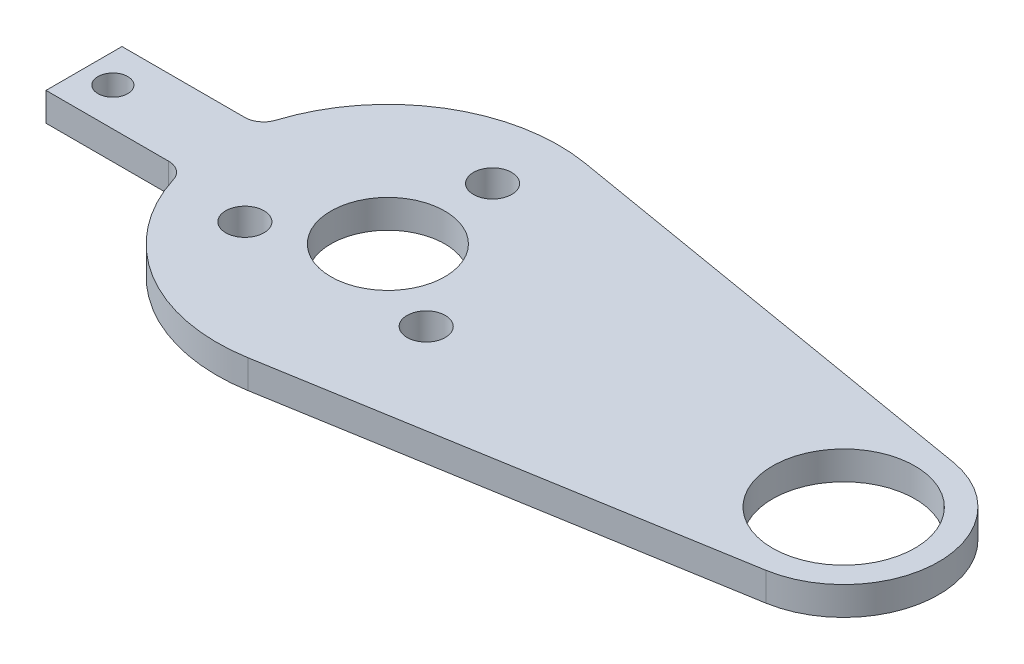
ISO-10303-21;
HEADER;
FILE_DESCRIPTION(('STEP AP214'),'2;1');
FILE_NAME('part.step','',(''),(''),'','','');
FILE_SCHEMA(('AUTOMOTIVE_DESIGN { 1 0 10303 214 1 1 1 1 }'));
ENDSEC;
DATA;
#1=APPLICATION_CONTEXT('core data for automotive mechanical design processes');
#2=APPLICATION_PROTOCOL_DEFINITION('international standard','automotive_design',2000,#1);
#3=PRODUCT_CONTEXT('',#1,'mechanical');
#4=PRODUCT('Part','Part','',(#3));
#5=PRODUCT_RELATED_PRODUCT_CATEGORY('part','',(#4));
#6=PRODUCT_DEFINITION_FORMATION('','',#4);
#7=PRODUCT_DEFINITION_CONTEXT('part definition',#1,'design');
#8=PRODUCT_DEFINITION('design','',#6,#7);
#9=PRODUCT_DEFINITION_SHAPE('','',#8);
#10=(LENGTH_UNIT() NAMED_UNIT(*) SI_UNIT(.MILLI.,.METRE.));
#11=(NAMED_UNIT(*) PLANE_ANGLE_UNIT() SI_UNIT($,.RADIAN.));
#12=(NAMED_UNIT(*) SI_UNIT($,.STERADIAN.) SOLID_ANGLE_UNIT());
#13=UNCERTAINTY_MEASURE_WITH_UNIT(LENGTH_MEASURE(1.E-05),#10,'distance_accuracy_value','');
#14=(GEOMETRIC_REPRESENTATION_CONTEXT(3) GLOBAL_UNCERTAINTY_ASSIGNED_CONTEXT((#13)) GLOBAL_UNIT_ASSIGNED_CONTEXT((#10,
#11,#12)) REPRESENTATION_CONTEXT('',''));
#15=CARTESIAN_POINT('',(0.,0.,0.));
#16=DIRECTION('',(0.,0.,1.));
#17=DIRECTION('',(1.,0.,0.));
#18=AXIS2_PLACEMENT_3D('',#15,#16,#17);
#19=CARTESIAN_POINT('',(76.2,4.7625,0.));
#20=DIRECTION('',(0.,-1.,0.));
#21=DIRECTION('',(0.,0.,-1.));
#22=AXIS2_PLACEMENT_3D('',#19,#20,#21);
#23=CYLINDRICAL_SURFACE('',#22,15.875);
#24=CARTESIAN_POINT('',(76.2,0.,0.));
#25=DIRECTION('',(0.,1.,0.));
#26=DIRECTION('',(0.,0.,1.));
#27=AXIS2_PLACEMENT_3D('',#24,#25,#26);
#28=CIRCLE('',#27,15.875);
#29=CARTESIAN_POINT('',(78.8458333333333,0.,15.6529610927844));
#30=VERTEX_POINT('',#29);
#31=CARTESIAN_POINT('',(78.8458333333333,0.,-15.6529610927844));
#32=VERTEX_POINT('',#31);
#33=EDGE_CURVE('E132',#30,#32,#28,.T.);
#34=ORIENTED_EDGE('',*,*,#33,.T.);
#35=DIRECTION('',(0.,-1.,0.));
#36=VECTOR('',#35,1.);
#37=CARTESIAN_POINT('',(78.8458333333333,4.7625,-15.6529610927844));
#38=LINE('',#37,#36);
#39=CARTESIAN_POINT('',(78.8458333333333,4.7625,-15.6529610927844));
#40=VERTEX_POINT('',#39);
#41=EDGE_CURVE('E114',#40,#32,#38,.T.);
#42=ORIENTED_EDGE('',*,*,#41,.F.);
#43=CARTESIAN_POINT('',(76.2,4.7625,0.));
#44=DIRECTION('',(0.,1.,0.));
#45=DIRECTION('',(0.,0.,1.));
#46=AXIS2_PLACEMENT_3D('',#43,#44,#45);
#47=CIRCLE('',#46,15.875);
#48=CARTESIAN_POINT('',(78.8458333333333,4.7625,15.6529610927844));
#49=VERTEX_POINT('',#48);
#50=EDGE_CURVE('E120',#49,#40,#47,.T.);
#51=ORIENTED_EDGE('',*,*,#50,.F.);
#52=DIRECTION('',(0.,-1.,0.));
#53=VECTOR('',#52,1.);
#54=CARTESIAN_POINT('',(78.8458333333333,4.7625,15.6529610927844));
#55=LINE('',#54,#53);
#56=EDGE_CURVE('E187',#49,#30,#55,.T.);
#57=ORIENTED_EDGE('',*,*,#56,.T.);
#58=EDGE_LOOP('',(#34,#42,#51,#57));
#59=FACE_BOUND('',#58,.T.);
#60=ADVANCED_FACE('F33',(#59),#23,.T.);
#61=CARTESIAN_POINT('',(4.7625,4.7625,-28.1753299670119));
#62=DIRECTION('',(-0.166666666666667,0.,0.986013297183269));
#63=DIRECTION('',(0.986013297183269,0.,0.166666666666667));
#64=AXIS2_PLACEMENT_3D('',#61,#62,#63);
#65=PLANE('',#64);
#66=DIRECTION('',(-0.986013297183269,0.,-0.166666666666667));
#67=VECTOR('',#66,1.);
#68=CARTESIAN_POINT('',(4.7625,0.,-28.1753299670119));
#69=LINE('',#68,#67);
#70=CARTESIAN_POINT('',(4.7625,0.,-28.1753299670119));
#71=VERTEX_POINT('',#70);
#72=EDGE_CURVE('E199',#32,#71,#69,.T.);
#73=ORIENTED_EDGE('',*,*,#72,.T.);
#74=DIRECTION('',(0.,-1.,0.));
#75=VECTOR('',#74,1.);
#76=CARTESIAN_POINT('',(4.7625,4.7625,-28.1753299670119));
#77=LINE('',#76,#75);
#78=CARTESIAN_POINT('',(4.7625,4.7625,-28.1753299670119));
#79=VERTEX_POINT('',#78);
#80=EDGE_CURVE('E117',#79,#71,#77,.T.);
#81=ORIENTED_EDGE('',*,*,#80,.F.);
#82=DIRECTION('',(-0.986013297183269,0.,-0.166666666666667));
#83=VECTOR('',#82,1.);
#84=CARTESIAN_POINT('',(4.7625,4.7625,-28.1753299670119));
#85=LINE('',#84,#83);
#86=EDGE_CURVE('E110',#40,#79,#85,.T.);
#87=ORIENTED_EDGE('',*,*,#86,.F.);
#88=ORIENTED_EDGE('',*,*,#41,.T.);
#89=EDGE_LOOP('',(#73,#81,#87,#88));
#90=FACE_BOUND('',#89,.T.);
#91=ADVANCED_FACE('F112',(#90),#65,.F.);
#92=CARTESIAN_POINT('',(0.,4.7625,0.));
#93=DIRECTION('',(0.,-1.,0.));
#94=DIRECTION('',(0.,0.,-1.));
#95=AXIS2_PLACEMENT_3D('',#92,#93,#94);
#96=CYLINDRICAL_SURFACE('',#95,28.575);
#97=CARTESIAN_POINT('',(0.,0.,0.));
#98=DIRECTION('',(0.,1.,0.));
#99=DIRECTION('',(0.,0.,1.));
#100=AXIS2_PLACEMENT_3D('',#97,#98,#99);
#101=CIRCLE('',#100,28.575);
#102=CARTESIAN_POINT('',(-27.2588126804892,0.,-8.57249999999999));
#103=VERTEX_POINT('',#102);
#104=EDGE_CURVE('E198',#71,#103,#101,.T.);
#105=ORIENTED_EDGE('',*,*,#104,.T.);
#106=DIRECTION('',(0.,-1.,0.));
#107=VECTOR('',#106,1.);
#108=CARTESIAN_POINT('',(-27.2588126804892,4.7625,-8.57249999999999));
#109=LINE('',#108,#107);
#110=CARTESIAN_POINT('',(-27.2588126804892,4.7625,-8.57249999999999));
#111=VERTEX_POINT('',#110);
#112=EDGE_CURVE('E48',#103,#111,#109,.F.);
#113=ORIENTED_EDGE('',*,*,#112,.T.);
#114=CARTESIAN_POINT('',(0.,4.7625,0.));
#115=DIRECTION('',(0.,1.,0.));
#116=DIRECTION('',(0.,0.,1.));
#117=AXIS2_PLACEMENT_3D('',#114,#115,#116);
#118=CIRCLE('',#117,28.575);
#119=EDGE_CURVE('E119',#79,#111,#118,.T.);
#120=ORIENTED_EDGE('',*,*,#119,.F.);
#121=ORIENTED_EDGE('',*,*,#80,.T.);
#122=EDGE_LOOP('',(#105,#113,#120,#121));
#123=FACE_BOUND('',#122,.T.);
#124=ADVANCED_FACE('F284',(#123),#96,.T.);
#125=CARTESIAN_POINT('',(-27.86051192997,4.7625,-6.34999999999999));
#126=DIRECTION('',(0.,0.,1.));
#127=DIRECTION('',(1.,0.,0.));
#128=AXIS2_PLACEMENT_3D('',#125,#126,#127);
#129=PLANE('',#128);
#130=DIRECTION('',(-1.,0.,0.));
#131=VECTOR('',#130,1.);
#132=CARTESIAN_POINT('',(-27.86051192997,4.7625,-6.34999999999999));
#133=LINE('',#132,#131);
#134=CARTESIAN_POINT('',(-30.287569644988,4.7625,-6.34999999999999));
#135=VERTEX_POINT('',#134);
#136=CARTESIAN_POINT('',(-50.8,4.7625,-6.35));
#137=VERTEX_POINT('',#136);
#138=EDGE_CURVE('E208',#135,#137,#133,.T.);
#139=ORIENTED_EDGE('',*,*,#138,.F.);
#140=DIRECTION('',(0.,1.,0.));
#141=VECTOR('',#140,1.);
#142=CARTESIAN_POINT('',(-30.287569644988,0.,-6.34999999999999));
#143=LINE('',#142,#141);
#144=CARTESIAN_POINT('',(-30.287569644988,0.,-6.34999999999999));
#145=VERTEX_POINT('',#144);
#146=EDGE_CURVE('E143',#135,#145,#143,.F.);
#147=ORIENTED_EDGE('',*,*,#146,.T.);
#148=DIRECTION('',(-1.,0.,0.));
#149=VECTOR('',#148,1.);
#150=CARTESIAN_POINT('',(-27.86051192997,0.,-6.34999999999999));
#151=LINE('',#150,#149);
#152=CARTESIAN_POINT('',(-50.8,0.,-6.35));
#153=VERTEX_POINT('',#152);
#154=EDGE_CURVE('E182',#145,#153,#151,.T.);
#155=ORIENTED_EDGE('',*,*,#154,.T.);
#156=DIRECTION('',(0.,-1.,0.));
#157=VECTOR('',#156,1.);
#158=CARTESIAN_POINT('',(-50.8,4.7625,-6.35));
#159=LINE('',#158,#157);
#160=EDGE_CURVE('E138',#137,#153,#159,.T.);
#161=ORIENTED_EDGE('',*,*,#160,.F.);
#162=EDGE_LOOP('',(#139,#147,#155,#161));
#163=FACE_BOUND('',#162,.T.);
#164=ADVANCED_FACE('F337',(#163),#129,.F.);
#165=CARTESIAN_POINT('',(-50.8,4.7625,6.35));
#166=DIRECTION('',(1.,0.,0.));
#167=DIRECTION('',(0.,0.,-1.));
#168=AXIS2_PLACEMENT_3D('',#165,#166,#167);
#169=PLANE('',#168);
#170=DIRECTION('',(0.,0.,1.));
#171=VECTOR('',#170,1.);
#172=CARTESIAN_POINT('',(-50.8,0.,6.35));
#173=LINE('',#172,#171);
#174=CARTESIAN_POINT('',(-50.8,0.,6.35));
#175=VERTEX_POINT('',#174);
#176=EDGE_CURVE('E179',#153,#175,#173,.T.);
#177=ORIENTED_EDGE('',*,*,#176,.T.);
#178=DIRECTION('',(0.,-1.,0.));
#179=VECTOR('',#178,1.);
#180=CARTESIAN_POINT('',(-50.8,4.7625,6.35));
#181=LINE('',#180,#179);
#182=CARTESIAN_POINT('',(-50.8,4.7625,6.35));
#183=VERTEX_POINT('',#182);
#184=EDGE_CURVE('E178',#183,#175,#181,.T.);
#185=ORIENTED_EDGE('',*,*,#184,.F.);
#186=DIRECTION('',(0.,0.,1.));
#187=VECTOR('',#186,1.);
#188=CARTESIAN_POINT('',(-50.8,4.7625,6.35));
#189=LINE('',#188,#187);
#190=EDGE_CURVE('E195',#137,#183,#189,.T.);
#191=ORIENTED_EDGE('',*,*,#190,.F.);
#192=ORIENTED_EDGE('',*,*,#160,.T.);
#193=EDGE_LOOP('',(#177,#185,#191,#192));
#194=FACE_BOUND('',#193,.T.);
#195=ADVANCED_FACE('F194',(#194),#169,.F.);
#196=CARTESIAN_POINT('',(-27.86051192997,4.7625,6.35000000000001));
#197=DIRECTION('',(0.,0.,-1.));
#198=DIRECTION('',(-1.,0.,0.));
#199=AXIS2_PLACEMENT_3D('',#196,#197,#198);
#200=PLANE('',#199);
#201=DIRECTION('',(1.,0.,0.));
#202=VECTOR('',#201,1.);
#203=CARTESIAN_POINT('',(-27.86051192997,0.,6.35000000000001));
#204=LINE('',#203,#202);
#205=CARTESIAN_POINT('',(-30.287569644988,0.,6.35000000000001));
#206=VERTEX_POINT('',#205);
#207=EDGE_CURVE('E171',#175,#206,#204,.T.);
#208=ORIENTED_EDGE('',*,*,#207,.T.);
#209=DIRECTION('',(0.,1.,0.));
#210=VECTOR('',#209,1.);
#211=CARTESIAN_POINT('',(-30.287569644988,4.7625,6.35000000000001));
#212=LINE('',#211,#210);
#213=CARTESIAN_POINT('',(-30.287569644988,4.7625,6.35000000000001));
#214=VERTEX_POINT('',#213);
#215=EDGE_CURVE('E136',#206,#214,#212,.T.);
#216=ORIENTED_EDGE('',*,*,#215,.T.);
#217=DIRECTION('',(1.,0.,0.));
#218=VECTOR('',#217,1.);
#219=CARTESIAN_POINT('',(-27.86051192997,4.7625,6.35000000000001));
#220=LINE('',#219,#218);
#221=EDGE_CURVE('E156',#183,#214,#220,.T.);
#222=ORIENTED_EDGE('',*,*,#221,.F.);
#223=ORIENTED_EDGE('',*,*,#184,.T.);
#224=EDGE_LOOP('',(#208,#216,#222,#223));
#225=FACE_BOUND('',#224,.T.);
#226=ADVANCED_FACE('F176',(#225),#200,.F.);
#227=CARTESIAN_POINT('',(0.,4.7625,0.));
#228=DIRECTION('',(0.,-1.,0.));
#229=DIRECTION('',(0.,0.,-1.));
#230=AXIS2_PLACEMENT_3D('',#227,#228,#229);
#231=CYLINDRICAL_SURFACE('',#230,28.575);
#232=CARTESIAN_POINT('',(0.,4.7625,0.));
#233=DIRECTION('',(0.,1.,0.));
#234=DIRECTION('',(0.,0.,1.));
#235=AXIS2_PLACEMENT_3D('',#232,#233,#234);
#236=CIRCLE('',#235,28.575);
#237=CARTESIAN_POINT('',(-27.2588126804892,4.7625,8.5725));
#238=VERTEX_POINT('',#237);
#239=CARTESIAN_POINT('',(4.76250000000001,4.7625,28.1753299670119));
#240=VERTEX_POINT('',#239);
#241=EDGE_CURVE('E153',#238,#240,#236,.T.);
#242=ORIENTED_EDGE('',*,*,#241,.F.);
#243=DIRECTION('',(0.,-1.,0.));
#244=VECTOR('',#243,1.);
#245=CARTESIAN_POINT('',(-27.2588126804892,4.7625,8.5725));
#246=LINE('',#245,#244);
#247=CARTESIAN_POINT('',(-27.2588126804892,0.,8.5725));
#248=VERTEX_POINT('',#247);
#249=EDGE_CURVE('E133',#238,#248,#246,.T.);
#250=ORIENTED_EDGE('',*,*,#249,.T.);
#251=CARTESIAN_POINT('',(0.,0.,0.));
#252=DIRECTION('',(0.,1.,0.));
#253=DIRECTION('',(0.,0.,1.));
#254=AXIS2_PLACEMENT_3D('',#251,#252,#253);
#255=CIRCLE('',#254,28.575);
#256=CARTESIAN_POINT('',(4.76250000000001,0.,28.1753299670119));
#257=VERTEX_POINT('',#256);
#258=EDGE_CURVE('E173',#248,#257,#255,.T.);
#259=ORIENTED_EDGE('',*,*,#258,.T.);
#260=DIRECTION('',(0.,-1.,0.));
#261=VECTOR('',#260,1.);
#262=CARTESIAN_POINT('',(4.76250000000001,4.7625,28.1753299670119));
#263=LINE('',#262,#261);
#264=EDGE_CURVE('E164',#240,#257,#263,.T.);
#265=ORIENTED_EDGE('',*,*,#264,.F.);
#266=EDGE_LOOP('',(#242,#250,#259,#265));
#267=FACE_BOUND('',#266,.T.);
#268=ADVANCED_FACE('F161',(#267),#231,.T.);
#269=CARTESIAN_POINT('',(4.7625,4.7625,28.1753299670119));
#270=DIRECTION('',(-0.166666666666667,0.,-0.986013297183269));
#271=DIRECTION('',(-0.986013297183269,0.,0.166666666666667));
#272=AXIS2_PLACEMENT_3D('',#269,#270,#271);
#273=PLANE('',#272);
#274=DIRECTION('',(0.986013297183269,0.,-0.166666666666667));
#275=VECTOR('',#274,1.);
#276=CARTESIAN_POINT('',(4.7625,0.,28.1753299670119));
#277=LINE('',#276,#275);
#278=EDGE_CURVE('E129',#257,#30,#277,.T.);
#279=ORIENTED_EDGE('',*,*,#278,.T.);
#280=ORIENTED_EDGE('',*,*,#56,.F.);
#281=DIRECTION('',(0.986013297183269,0.,-0.166666666666667));
#282=VECTOR('',#281,1.);
#283=CARTESIAN_POINT('',(4.7625,4.7625,28.1753299670119));
#284=LINE('',#283,#282);
#285=EDGE_CURVE('E125',#240,#49,#284,.T.);
#286=ORIENTED_EDGE('',*,*,#285,.F.);
#287=ORIENTED_EDGE('',*,*,#264,.T.);
#288=EDGE_LOOP('',(#279,#280,#286,#287));
#289=FACE_BOUND('',#288,.T.);
#290=ADVANCED_FACE('F252',(#289),#273,.F.);
#291=CARTESIAN_POINT('',(76.2,4.7625,0.));
#292=DIRECTION('',(0.,1.,0.));
#293=DIRECTION('',(0.,0.,1.));
#294=AXIS2_PLACEMENT_3D('',#291,#292,#293);
#295=PLANE('',#294);
#296=CARTESIAN_POINT('',(-45.974,4.7625,0.));
#297=DIRECTION('',(0.,1.,0.));
#298=DIRECTION('',(0.,0.,1.));
#299=AXIS2_PLACEMENT_3D('',#296,#297,#298);
#300=CIRCLE('',#299,2.4892);
#301=CARTESIAN_POINT('',(-45.974,4.7625,2.4892));
#302=VERTEX_POINT('',#301);
#303=EDGE_CURVE('E243',#302,#302,#300,.T.);
#304=ORIENTED_EDGE('',*,*,#303,.F.);
#305=EDGE_LOOP('',(#304));
#306=FACE_BOUND('',#305,.T.);
#307=CARTESIAN_POINT('',(0.,4.7625,0.));
#308=DIRECTION('',(0.,1.,0.));
#309=DIRECTION('',(0.,0.,1.));
#310=AXIS2_PLACEMENT_3D('',#307,#308,#309);
#311=CIRCLE('',#310,9.525);
#312=CARTESIAN_POINT('',(0.,4.7625,9.525));
#313=VERTEX_POINT('',#312);
#314=EDGE_CURVE('E235',#313,#313,#311,.T.);
#315=ORIENTED_EDGE('',*,*,#314,.F.);
#316=EDGE_LOOP('',(#315));
#317=FACE_BOUND('',#316,.T.);
#318=CARTESIAN_POINT('',(0.,4.7625,-17.5));
#319=DIRECTION('',(0.,1.,0.));
#320=DIRECTION('',(0.,0.,1.));
#321=AXIS2_PLACEMENT_3D('',#318,#319,#320);
#322=CIRCLE('',#321,3.19999999999999);
#323=CARTESIAN_POINT('',(0.,4.7625,-14.3));
#324=VERTEX_POINT('',#323);
#325=EDGE_CURVE('E231',#324,#324,#322,.T.);
#326=ORIENTED_EDGE('',*,*,#325,.F.);
#327=EDGE_LOOP('',(#326));
#328=FACE_BOUND('',#327,.T.);
#329=CARTESIAN_POINT('',(-15.1554445662277,4.7625,8.75));
#330=DIRECTION('',(0.,1.,0.));
#331=DIRECTION('',(0.,0.,1.));
#332=AXIS2_PLACEMENT_3D('',#329,#330,#331);
#333=CIRCLE('',#332,3.19999999999999);
#334=CARTESIAN_POINT('',(-15.1554445662277,4.7625,11.95));
#335=VERTEX_POINT('',#334);
#336=EDGE_CURVE('E225',#335,#335,#333,.T.);
#337=ORIENTED_EDGE('',*,*,#336,.F.);
#338=EDGE_LOOP('',(#337));
#339=FACE_BOUND('',#338,.T.);
#340=CARTESIAN_POINT('',(15.1554445662277,4.7625,8.75));
#341=DIRECTION('',(0.,1.,0.));
#342=DIRECTION('',(0.,0.,1.));
#343=AXIS2_PLACEMENT_3D('',#340,#341,#342);
#344=CIRCLE('',#343,3.19999999999999);
#345=CARTESIAN_POINT('',(15.1554445662277,4.7625,11.95));
#346=VERTEX_POINT('',#345);
#347=EDGE_CURVE('E219',#346,#346,#344,.T.);
#348=ORIENTED_EDGE('',*,*,#347,.F.);
#349=EDGE_LOOP('',(#348));
#350=FACE_BOUND('',#349,.T.);
#351=CARTESIAN_POINT('',(76.2,4.7625,0.));
#352=DIRECTION('',(0.,1.,0.));
#353=DIRECTION('',(0.,0.,1.));
#354=AXIS2_PLACEMENT_3D('',#351,#352,#353);
#355=CIRCLE('',#354,11.90625);
#356=CARTESIAN_POINT('',(76.2,4.7625,11.90625));
#357=VERTEX_POINT('',#356);
#358=EDGE_CURVE('E211',#357,#357,#355,.T.);
#359=ORIENTED_EDGE('',*,*,#358,.F.);
#360=EDGE_LOOP('',(#359));
#361=FACE_BOUND('',#360,.T.);
#362=ORIENTED_EDGE('',*,*,#50,.T.);
#363=ORIENTED_EDGE('',*,*,#86,.T.);
#364=ORIENTED_EDGE('',*,*,#119,.T.);
#365=CARTESIAN_POINT('',(-30.287569644988,4.7625,-9.52499999999999));
#366=DIRECTION('',(0.,1.,0.));
#367=DIRECTION('',(0.,0.,1.));
#368=AXIS2_PLACEMENT_3D('',#365,#366,#367);
#369=CIRCLE('',#368,3.175);
#370=EDGE_CURVE('E11',#111,#135,#369,.F.);
#371=ORIENTED_EDGE('',*,*,#370,.T.);
#372=ORIENTED_EDGE('',*,*,#138,.T.);
#373=ORIENTED_EDGE('',*,*,#190,.T.);
#374=ORIENTED_EDGE('',*,*,#221,.T.);
#375=CARTESIAN_POINT('',(-30.287569644988,4.7625,9.525));
#376=DIRECTION('',(0.,1.,0.));
#377=DIRECTION('',(0.,0.,1.));
#378=AXIS2_PLACEMENT_3D('',#375,#376,#377);
#379=CIRCLE('',#378,3.175);
#380=EDGE_CURVE('E149',#214,#238,#379,.F.);
#381=ORIENTED_EDGE('',*,*,#380,.T.);
#382=ORIENTED_EDGE('',*,*,#241,.T.);
#383=ORIENTED_EDGE('',*,*,#285,.T.);
#384=EDGE_LOOP('',(#362,#363,#364,#371,#372,#373,#374,#381,#382,#383));
#385=FACE_BOUND('',#384,.T.);
#386=ADVANCED_FACE('F123',(#306,#317,#328,#339,#350,#361,#385),#295,.T.);
#387=CARTESIAN_POINT('',(76.2,0.,0.));
#388=DIRECTION('',(0.,1.,0.));
#389=DIRECTION('',(0.,0.,1.));
#390=AXIS2_PLACEMENT_3D('',#387,#388,#389);
#391=PLANE('',#390);
#392=CARTESIAN_POINT('',(-45.974,0.,0.));
#393=DIRECTION('',(0.,1.,0.));
#394=DIRECTION('',(0.,0.,1.));
#395=AXIS2_PLACEMENT_3D('',#392,#393,#394);
#396=CIRCLE('',#395,2.4892);
#397=CARTESIAN_POINT('',(-45.974,0.,2.4892));
#398=VERTEX_POINT('',#397);
#399=EDGE_CURVE('E238',#398,#398,#396,.T.);
#400=ORIENTED_EDGE('',*,*,#399,.T.);
#401=EDGE_LOOP('',(#400));
#402=FACE_BOUND('',#401,.T.);
#403=CARTESIAN_POINT('',(0.,0.,0.));
#404=DIRECTION('',(0.,1.,0.));
#405=DIRECTION('',(0.,0.,1.));
#406=AXIS2_PLACEMENT_3D('',#403,#404,#405);
#407=CIRCLE('',#406,9.525);
#408=CARTESIAN_POINT('',(0.,0.,9.525));
#409=VERTEX_POINT('',#408);
#410=EDGE_CURVE('E234',#409,#409,#407,.T.);
#411=ORIENTED_EDGE('',*,*,#410,.T.);
#412=EDGE_LOOP('',(#411));
#413=FACE_BOUND('',#412,.T.);
#414=CARTESIAN_POINT('',(0.,0.,-17.5));
#415=DIRECTION('',(0.,1.,0.));
#416=DIRECTION('',(0.,0.,1.));
#417=AXIS2_PLACEMENT_3D('',#414,#415,#416);
#418=CIRCLE('',#417,3.2);
#419=CARTESIAN_POINT('',(0.,0.,-14.3));
#420=VERTEX_POINT('',#419);
#421=EDGE_CURVE('E228',#420,#420,#418,.T.);
#422=ORIENTED_EDGE('',*,*,#421,.T.);
#423=EDGE_LOOP('',(#422));
#424=FACE_BOUND('',#423,.T.);
#425=CARTESIAN_POINT('',(-15.1554445662277,0.,8.75));
#426=DIRECTION('',(0.,1.,0.));
#427=DIRECTION('',(0.,0.,1.));
#428=AXIS2_PLACEMENT_3D('',#425,#426,#427);
#429=CIRCLE('',#428,3.2);
#430=CARTESIAN_POINT('',(-15.1554445662277,0.,11.95));
#431=VERTEX_POINT('',#430);
#432=EDGE_CURVE('E222',#431,#431,#429,.T.);
#433=ORIENTED_EDGE('',*,*,#432,.T.);
#434=EDGE_LOOP('',(#433));
#435=FACE_BOUND('',#434,.T.);
#436=CARTESIAN_POINT('',(15.1554445662277,0.,8.75));
#437=DIRECTION('',(0.,1.,0.));
#438=DIRECTION('',(0.,0.,1.));
#439=AXIS2_PLACEMENT_3D('',#436,#437,#438);
#440=CIRCLE('',#439,3.2);
#441=CARTESIAN_POINT('',(15.1554445662277,0.,11.95));
#442=VERTEX_POINT('',#441);
#443=EDGE_CURVE('E214',#442,#442,#440,.T.);
#444=ORIENTED_EDGE('',*,*,#443,.T.);
#445=EDGE_LOOP('',(#444));
#446=FACE_BOUND('',#445,.T.);
#447=CARTESIAN_POINT('',(76.2,0.,0.));
#448=DIRECTION('',(0.,1.,0.));
#449=DIRECTION('',(0.,0.,1.));
#450=AXIS2_PLACEMENT_3D('',#447,#448,#449);
#451=CIRCLE('',#450,11.90625);
#452=CARTESIAN_POINT('',(76.2,0.,11.90625));
#453=VERTEX_POINT('',#452);
#454=EDGE_CURVE('E204',#453,#453,#451,.T.);
#455=ORIENTED_EDGE('',*,*,#454,.T.);
#456=EDGE_LOOP('',(#455));
#457=FACE_BOUND('',#456,.T.);
#458=ORIENTED_EDGE('',*,*,#33,.F.);
#459=ORIENTED_EDGE('',*,*,#278,.F.);
#460=ORIENTED_EDGE('',*,*,#258,.F.);
#461=CARTESIAN_POINT('',(-30.287569644988,0.,9.525));
#462=DIRECTION('',(0.,1.,0.));
#463=DIRECTION('',(0.,0.,1.));
#464=AXIS2_PLACEMENT_3D('',#461,#462,#463);
#465=CIRCLE('',#464,3.175);
#466=EDGE_CURVE('E147',#248,#206,#465,.T.);
#467=ORIENTED_EDGE('',*,*,#466,.T.);
#468=ORIENTED_EDGE('',*,*,#207,.F.);
#469=ORIENTED_EDGE('',*,*,#176,.F.);
#470=ORIENTED_EDGE('',*,*,#154,.F.);
#471=CARTESIAN_POINT('',(-30.287569644988,0.,-9.52499999999999));
#472=DIRECTION('',(0.,1.,0.));
#473=DIRECTION('',(0.,0.,1.));
#474=AXIS2_PLACEMENT_3D('',#471,#472,#473);
#475=CIRCLE('',#474,3.175);
#476=EDGE_CURVE('E41',#145,#103,#475,.T.);
#477=ORIENTED_EDGE('',*,*,#476,.T.);
#478=ORIENTED_EDGE('',*,*,#104,.F.);
#479=ORIENTED_EDGE('',*,*,#72,.F.);
#480=EDGE_LOOP('',(#458,#459,#460,#467,#468,#469,#470,#477,#478,#479));
#481=FACE_BOUND('',#480,.T.);
#482=ADVANCED_FACE('F169',(#402,#413,#424,#435,#446,#457,#481),#391,.F.);
#483=CARTESIAN_POINT('',(76.2,0.,0.));
#484=DIRECTION('',(0.,1.,0.));
#485=DIRECTION('',(0.,0.,1.));
#486=AXIS2_PLACEMENT_3D('',#483,#484,#485);
#487=CYLINDRICAL_SURFACE('',#486,11.90625);
#488=CARTESIAN_POINT('',(76.2,0.,11.90625));
#489=CARTESIAN_POINT('',(76.2,0.049609375,11.90625));
#490=CARTESIAN_POINT('',(76.2,0.09921875,11.90625));
#491=CARTESIAN_POINT('',(76.2,0.1984375,11.90625));
#492=CARTESIAN_POINT('',(76.2,0.248046875,11.90625));
#493=CARTESIAN_POINT('',(76.2,0.347265625,11.90625));
#494=CARTESIAN_POINT('',(76.2,0.396875,11.90625));
#495=CARTESIAN_POINT('',(76.2,0.49609375,11.90625));
#496=CARTESIAN_POINT('',(76.2,0.545703125,11.90625));
#497=CARTESIAN_POINT('',(76.2,0.644921875,11.90625));
#498=CARTESIAN_POINT('',(76.2,0.69453125,11.90625));
#499=CARTESIAN_POINT('',(76.2,0.79375,11.90625));
#500=CARTESIAN_POINT('',(76.2,0.843359375,11.90625));
#501=CARTESIAN_POINT('',(76.2,0.942578125,11.90625));
#502=CARTESIAN_POINT('',(76.2,0.9921875,11.90625));
#503=CARTESIAN_POINT('',(76.2,1.09140625,11.90625));
#504=CARTESIAN_POINT('',(76.2,1.141015625,11.90625));
#505=CARTESIAN_POINT('',(76.2,1.240234375,11.90625));
#506=CARTESIAN_POINT('',(76.2,1.28984375,11.90625));
#507=CARTESIAN_POINT('',(76.2,1.3890625,11.90625));
#508=CARTESIAN_POINT('',(76.2,1.438671875,11.90625));
#509=CARTESIAN_POINT('',(76.2,1.537890625,11.90625));
#510=CARTESIAN_POINT('',(76.2,1.5875,11.90625));
#511=CARTESIAN_POINT('',(76.2,1.68671875,11.90625));
#512=CARTESIAN_POINT('',(76.2,1.736328125,11.90625));
#513=CARTESIAN_POINT('',(76.2,1.835546875,11.90625));
#514=CARTESIAN_POINT('',(76.2,1.88515625,11.90625));
#515=CARTESIAN_POINT('',(76.2,1.984375,11.90625));
#516=CARTESIAN_POINT('',(76.2,2.033984375,11.90625));
#517=CARTESIAN_POINT('',(76.2,2.133203125,11.90625));
#518=CARTESIAN_POINT('',(76.2,2.1828125,11.90625));
#519=CARTESIAN_POINT('',(76.2,2.28203125,11.90625));
#520=CARTESIAN_POINT('',(76.2,2.331640625,11.90625));
#521=CARTESIAN_POINT('',(76.2,2.430859375,11.90625));
#522=CARTESIAN_POINT('',(76.2,2.48046875,11.90625));
#523=CARTESIAN_POINT('',(76.2,2.5796875,11.90625));
#524=CARTESIAN_POINT('',(76.2,2.629296875,11.90625));
#525=CARTESIAN_POINT('',(76.2,2.728515625,11.90625));
#526=CARTESIAN_POINT('',(76.2,2.778125,11.90625));
#527=CARTESIAN_POINT('',(76.2,2.87734375,11.90625));
#528=CARTESIAN_POINT('',(76.2,2.926953125,11.90625));
#529=CARTESIAN_POINT('',(76.2,3.026171875,11.90625));
#530=CARTESIAN_POINT('',(76.2,3.07578125,11.90625));
#531=CARTESIAN_POINT('',(76.2,3.175,11.90625));
#532=CARTESIAN_POINT('',(76.2,3.224609375,11.90625));
#533=CARTESIAN_POINT('',(76.2,3.323828125,11.90625));
#534=CARTESIAN_POINT('',(76.2,3.3734375,11.90625));
#535=CARTESIAN_POINT('',(76.2,3.47265625,11.90625));
#536=CARTESIAN_POINT('',(76.2,3.522265625,11.90625));
#537=CARTESIAN_POINT('',(76.2,3.621484375,11.90625));
#538=CARTESIAN_POINT('',(76.2,3.67109375,11.90625));
#539=CARTESIAN_POINT('',(76.2,3.7703125,11.90625));
#540=CARTESIAN_POINT('',(76.2,3.819921875,11.90625));
#541=CARTESIAN_POINT('',(76.2,3.919140625,11.90625));
#542=CARTESIAN_POINT('',(76.2,3.96875,11.90625));
#543=CARTESIAN_POINT('',(76.2,4.06796875,11.90625));
#544=CARTESIAN_POINT('',(76.2,4.117578125,11.90625));
#545=CARTESIAN_POINT('',(76.2,4.216796875,11.90625));
#546=CARTESIAN_POINT('',(76.2,4.26640625,11.90625));
#547=CARTESIAN_POINT('',(76.2,4.365625,11.90625));
#548=CARTESIAN_POINT('',(76.2,4.415234375,11.90625));
#549=CARTESIAN_POINT('',(76.2,4.514453125,11.90625));
#550=CARTESIAN_POINT('',(76.2,4.5640625,11.90625));
#551=CARTESIAN_POINT('',(76.2,4.66328125,11.90625));
#552=CARTESIAN_POINT('',(76.2,4.712890625,11.90625));
#553=CARTESIAN_POINT('',(76.2,4.7625,11.90625));
#554=B_SPLINE_CURVE_WITH_KNOTS('',3,(#488,#489,#490,#491,#492,#493,#494,#495,#496,#497,#498,
#499,#500,#501,#502,#503,#504,#505,#506,#507,#508,#509,#510,#511,#512,#513,#514,#515,#516,#517,
#518,#519,#520,#521,#522,#523,#524,#525,#526,#527,#528,#529,#530,#531,#532,#533,#534,#535,#536,
#537,#538,#539,#540,#541,#542,#543,#544,#545,#546,#547,#548,#549,#550,#551,#552,#553),
.UNSPECIFIED.,.F.,.F.,(4,2,2,2,2,2,2,2,2,2,2,2,2,2,2,2,2,2,2,2,2,2,2,2,2,2,2,2,2,2,2,2,4),(0.,
0.148828125,0.29765625,0.446484375,0.5953125,0.744140625,0.89296875,1.041796875,1.190625,
1.339453125,1.48828125,1.637109375,1.7859375,1.934765625,2.08359375,2.232421875,2.38125,
2.530078125,2.67890625,2.827734375,2.9765625,3.125390625,3.27421875,3.423046875,3.571875,
3.720703125,3.86953125,4.018359375,4.1671875,4.316015625,4.46484375,4.613671875,4.7625),.UNSPECIFIED.);
#555=EDGE_CURVE('BSEAM264',#453,#357,#554,.T.);
#556=ORIENTED_EDGE('',*,*,#454,.F.);
#557=ORIENTED_EDGE('',*,*,#358,.T.);
#558=ORIENTED_EDGE('',*,*,#555,.T.);
#559=ORIENTED_EDGE('',*,*,#555,.F.);
#560=EDGE_LOOP('',(#556,#558,#557,#559));
#561=FACE_BOUND('',#560,.T.);
#562=ADVANCED_FACE('F264',(#561),#487,.F.);
#563=CARTESIAN_POINT('',(15.1554445662277,4.7625,8.75));
#564=DIRECTION('',(0.,1.,0.));
#565=DIRECTION('',(0.,0.,1.));
#566=AXIS2_PLACEMENT_3D('',#563,#564,#565);
#567=CYLINDRICAL_SURFACE('',#566,3.19999999999999);
#568=ORIENTED_EDGE('',*,*,#443,.F.);
#569=EDGE_LOOP('',(#568));
#570=FACE_BOUND('',#569,.T.);
#571=ORIENTED_EDGE('',*,*,#347,.T.);
#572=EDGE_LOOP('',(#571));
#573=FACE_BOUND('',#572,.T.);
#574=ADVANCED_FACE('F266',(#570,#573),#567,.F.);
#575=CARTESIAN_POINT('',(-15.1554445662277,4.7625,8.75));
#576=DIRECTION('',(0.,1.,0.));
#577=DIRECTION('',(0.,0.,1.));
#578=AXIS2_PLACEMENT_3D('',#575,#576,#577);
#579=CYLINDRICAL_SURFACE('',#578,3.19999999999999);
#580=ORIENTED_EDGE('',*,*,#432,.F.);
#581=EDGE_LOOP('',(#580));
#582=FACE_BOUND('',#581,.T.);
#583=ORIENTED_EDGE('',*,*,#336,.T.);
#584=EDGE_LOOP('',(#583));
#585=FACE_BOUND('',#584,.T.);
#586=ADVANCED_FACE('F273',(#582,#585),#579,.F.);
#587=CARTESIAN_POINT('',(0.,4.7625,-17.5));
#588=DIRECTION('',(0.,1.,0.));
#589=DIRECTION('',(0.,0.,1.));
#590=AXIS2_PLACEMENT_3D('',#587,#588,#589);
#591=CYLINDRICAL_SURFACE('',#590,3.19999999999999);
#592=ORIENTED_EDGE('',*,*,#421,.F.);
#593=EDGE_LOOP('',(#592));
#594=FACE_BOUND('',#593,.T.);
#595=ORIENTED_EDGE('',*,*,#325,.T.);
#596=EDGE_LOOP('',(#595));
#597=FACE_BOUND('',#596,.T.);
#598=ADVANCED_FACE('F294',(#594,#597),#591,.F.);
#599=CARTESIAN_POINT('',(0.,0.,0.));
#600=DIRECTION('',(0.,1.,0.));
#601=DIRECTION('',(0.,0.,1.));
#602=AXIS2_PLACEMENT_3D('',#599,#600,#601);
#603=CYLINDRICAL_SURFACE('',#602,9.525);
#604=CARTESIAN_POINT('',(0.,0.,9.525));
#605=CARTESIAN_POINT('',(0.,0.049609375,9.525));
#606=CARTESIAN_POINT('',(0.,0.09921875,9.525));
#607=CARTESIAN_POINT('',(0.,0.1984375,9.525));
#608=CARTESIAN_POINT('',(0.,0.248046875,9.525));
#609=CARTESIAN_POINT('',(0.,0.347265625,9.525));
#610=CARTESIAN_POINT('',(0.,0.396875,9.525));
#611=CARTESIAN_POINT('',(0.,0.49609375,9.525));
#612=CARTESIAN_POINT('',(0.,0.545703125,9.525));
#613=CARTESIAN_POINT('',(0.,0.644921875,9.525));
#614=CARTESIAN_POINT('',(0.,0.69453125,9.525));
#615=CARTESIAN_POINT('',(0.,0.79375,9.525));
#616=CARTESIAN_POINT('',(0.,0.843359375,9.525));
#617=CARTESIAN_POINT('',(0.,0.942578125,9.525));
#618=CARTESIAN_POINT('',(0.,0.9921875,9.525));
#619=CARTESIAN_POINT('',(0.,1.09140625,9.525));
#620=CARTESIAN_POINT('',(0.,1.141015625,9.525));
#621=CARTESIAN_POINT('',(0.,1.240234375,9.525));
#622=CARTESIAN_POINT('',(0.,1.28984375,9.525));
#623=CARTESIAN_POINT('',(0.,1.3890625,9.525));
#624=CARTESIAN_POINT('',(0.,1.438671875,9.525));
#625=CARTESIAN_POINT('',(0.,1.537890625,9.525));
#626=CARTESIAN_POINT('',(0.,1.5875,9.525));
#627=CARTESIAN_POINT('',(0.,1.68671875,9.525));
#628=CARTESIAN_POINT('',(0.,1.736328125,9.525));
#629=CARTESIAN_POINT('',(0.,1.835546875,9.525));
#630=CARTESIAN_POINT('',(0.,1.88515625,9.525));
#631=CARTESIAN_POINT('',(0.,1.984375,9.525));
#632=CARTESIAN_POINT('',(0.,2.033984375,9.525));
#633=CARTESIAN_POINT('',(0.,2.133203125,9.525));
#634=CARTESIAN_POINT('',(0.,2.1828125,9.525));
#635=CARTESIAN_POINT('',(0.,2.28203125,9.525));
#636=CARTESIAN_POINT('',(0.,2.331640625,9.525));
#637=CARTESIAN_POINT('',(0.,2.430859375,9.525));
#638=CARTESIAN_POINT('',(0.,2.48046875,9.525));
#639=CARTESIAN_POINT('',(0.,2.5796875,9.525));
#640=CARTESIAN_POINT('',(0.,2.629296875,9.525));
#641=CARTESIAN_POINT('',(0.,2.728515625,9.525));
#642=CARTESIAN_POINT('',(0.,2.778125,9.525));
#643=CARTESIAN_POINT('',(0.,2.87734375,9.525));
#644=CARTESIAN_POINT('',(0.,2.926953125,9.525));
#645=CARTESIAN_POINT('',(0.,3.026171875,9.525));
#646=CARTESIAN_POINT('',(0.,3.07578125,9.525));
#647=CARTESIAN_POINT('',(0.,3.175,9.525));
#648=CARTESIAN_POINT('',(0.,3.224609375,9.525));
#649=CARTESIAN_POINT('',(0.,3.323828125,9.525));
#650=CARTESIAN_POINT('',(0.,3.3734375,9.525));
#651=CARTESIAN_POINT('',(0.,3.47265625,9.525));
#652=CARTESIAN_POINT('',(0.,3.522265625,9.525));
#653=CARTESIAN_POINT('',(0.,3.621484375,9.525));
#654=CARTESIAN_POINT('',(0.,3.67109375,9.525));
#655=CARTESIAN_POINT('',(0.,3.7703125,9.525));
#656=CARTESIAN_POINT('',(0.,3.819921875,9.525));
#657=CARTESIAN_POINT('',(0.,3.919140625,9.525));
#658=CARTESIAN_POINT('',(0.,3.96875,9.525));
#659=CARTESIAN_POINT('',(0.,4.06796875,9.525));
#660=CARTESIAN_POINT('',(0.,4.117578125,9.525));
#661=CARTESIAN_POINT('',(0.,4.216796875,9.525));
#662=CARTESIAN_POINT('',(0.,4.26640625,9.525));
#663=CARTESIAN_POINT('',(0.,4.365625,9.525));
#664=CARTESIAN_POINT('',(0.,4.415234375,9.525));
#665=CARTESIAN_POINT('',(0.,4.514453125,9.525));
#666=CARTESIAN_POINT('',(0.,4.5640625,9.525));
#667=CARTESIAN_POINT('',(0.,4.66328125,9.525));
#668=CARTESIAN_POINT('',(0.,4.712890625,9.525));
#669=CARTESIAN_POINT('',(0.,4.7625,9.525));
#670=B_SPLINE_CURVE_WITH_KNOTS('',3,(#604,#605,#606,#607,#608,#609,#610,#611,#612,#613,#614,
#615,#616,#617,#618,#619,#620,#621,#622,#623,#624,#625,#626,#627,#628,#629,#630,#631,#632,#633,
#634,#635,#636,#637,#638,#639,#640,#641,#642,#643,#644,#645,#646,#647,#648,#649,#650,#651,#652,
#653,#654,#655,#656,#657,#658,#659,#660,#661,#662,#663,#664,#665,#666,#667,#668,#669),
.UNSPECIFIED.,.F.,.F.,(4,2,2,2,2,2,2,2,2,2,2,2,2,2,2,2,2,2,2,2,2,2,2,2,2,2,2,2,2,2,2,2,4),(0.,
0.148828125,0.29765625,0.446484375,0.5953125,0.744140625,0.89296875,1.041796875,1.190625,
1.339453125,1.48828125,1.637109375,1.7859375,1.934765625,2.08359375,2.232421875,2.38125,
2.530078125,2.67890625,2.827734375,2.9765625,3.125390625,3.27421875,3.423046875,3.571875,
3.720703125,3.86953125,4.018359375,4.1671875,4.316015625,4.46484375,4.613671875,4.7625),.UNSPECIFIED.);
#671=EDGE_CURVE('BSEAM288',#409,#313,#670,.T.);
#672=ORIENTED_EDGE('',*,*,#410,.F.);
#673=ORIENTED_EDGE('',*,*,#314,.T.);
#674=ORIENTED_EDGE('',*,*,#671,.T.);
#675=ORIENTED_EDGE('',*,*,#671,.F.);
#676=EDGE_LOOP('',(#672,#674,#673,#675));
#677=FACE_BOUND('',#676,.T.);
#678=ADVANCED_FACE('F288',(#677),#603,.F.);
#679=CARTESIAN_POINT('',(-30.287569644988,4.7625,9.525));
#680=DIRECTION('',(0.,-1.,0.));
#681=DIRECTION('',(0.,0.,-1.));
#682=AXIS2_PLACEMENT_3D('',#679,#680,#681);
#683=CYLINDRICAL_SURFACE('',#682,3.175);
#684=ORIENTED_EDGE('',*,*,#380,.F.);
#685=ORIENTED_EDGE('',*,*,#215,.F.);
#686=ORIENTED_EDGE('',*,*,#466,.F.);
#687=ORIENTED_EDGE('',*,*,#249,.F.);
#688=EDGE_LOOP('',(#684,#685,#686,#687));
#689=FACE_BOUND('',#688,.T.);
#690=ADVANCED_FACE('F166',(#689),#683,.F.);
#691=CARTESIAN_POINT('',(-30.287569644988,4.7625,-9.52499999999999));
#692=DIRECTION('',(0.,-1.,0.));
#693=DIRECTION('',(0.,0.,-1.));
#694=AXIS2_PLACEMENT_3D('',#691,#692,#693);
#695=CYLINDRICAL_SURFACE('',#694,3.175);
#696=ORIENTED_EDGE('',*,*,#370,.F.);
#697=ORIENTED_EDGE('',*,*,#112,.F.);
#698=ORIENTED_EDGE('',*,*,#476,.F.);
#699=ORIENTED_EDGE('',*,*,#146,.F.);
#700=EDGE_LOOP('',(#696,#697,#698,#699));
#701=FACE_BOUND('',#700,.T.);
#702=ADVANCED_FACE('F35',(#701),#695,.F.);
#703=CARTESIAN_POINT('',(-45.974,4.7625,0.));
#704=DIRECTION('',(0.,1.,0.));
#705=DIRECTION('',(0.,0.,1.));
#706=AXIS2_PLACEMENT_3D('',#703,#704,#705);
#707=CYLINDRICAL_SURFACE('',#706,2.4892);
#708=ORIENTED_EDGE('',*,*,#303,.T.);
#709=EDGE_LOOP('',(#708));
#710=FACE_BOUND('',#709,.T.);
#711=ORIENTED_EDGE('',*,*,#399,.F.);
#712=EDGE_LOOP('',(#711));
#713=FACE_BOUND('',#712,.T.);
#714=ADVANCED_FACE('F247',(#710,#713),#707,.F.);
#715=CLOSED_SHELL('',(#60,#91,#124,#164,#195,#226,#268,#290,#386,#482,#562,#574,#586,#598,#678,
#690,#702,#714));
#716=MANIFOLD_SOLID_BREP('B2',#715);
#717=ADVANCED_BREP_SHAPE_REPRESENTATION('',(#18,#716),#14);
#718=SHAPE_DEFINITION_REPRESENTATION(#9,#717);
ENDSEC;
END-ISO-10303-21;
